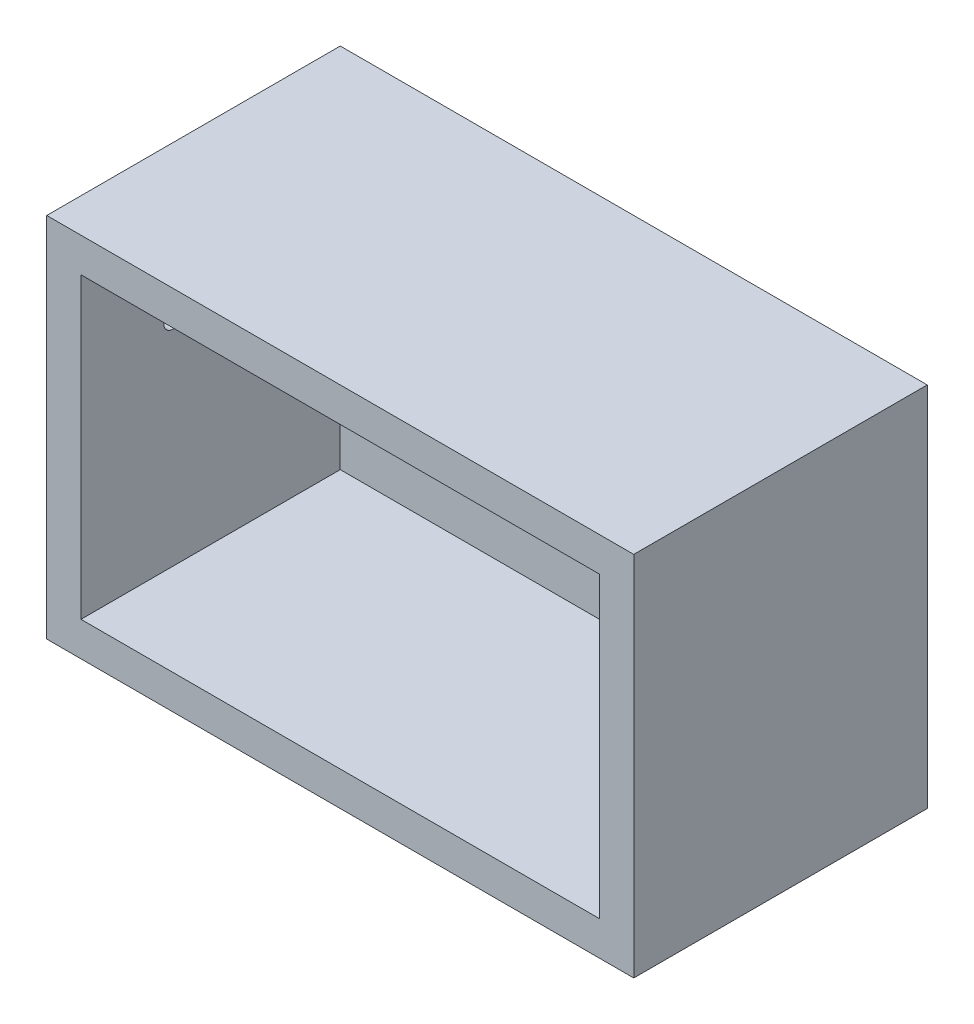
ISO-10303-21;
HEADER;
FILE_DESCRIPTION(('STEP AP214'),'2;1');
FILE_NAME('part.step','',(''),(''),'','','');
FILE_SCHEMA(('AUTOMOTIVE_DESIGN { 1 0 10303 214 1 1 1 1 }'));
ENDSEC;
DATA;
#1=APPLICATION_CONTEXT('core data for automotive mechanical design processes');
#2=APPLICATION_PROTOCOL_DEFINITION('international standard','automotive_design',2000,#1);
#3=PRODUCT_CONTEXT('',#1,'mechanical');
#4=PRODUCT('Part','Part','',(#3));
#5=PRODUCT_RELATED_PRODUCT_CATEGORY('part','',(#4));
#6=PRODUCT_DEFINITION_FORMATION('','',#4);
#7=PRODUCT_DEFINITION_CONTEXT('part definition',#1,'design');
#8=PRODUCT_DEFINITION('design','',#6,#7);
#9=PRODUCT_DEFINITION_SHAPE('','',#8);
#10=(LENGTH_UNIT() NAMED_UNIT(*) SI_UNIT(.MILLI.,.METRE.));
#11=(NAMED_UNIT(*) PLANE_ANGLE_UNIT() SI_UNIT($,.RADIAN.));
#12=(NAMED_UNIT(*) SI_UNIT($,.STERADIAN.) SOLID_ANGLE_UNIT());
#13=UNCERTAINTY_MEASURE_WITH_UNIT(LENGTH_MEASURE(1.E-05),#10,'distance_accuracy_value','');
#14=(GEOMETRIC_REPRESENTATION_CONTEXT(3) GLOBAL_UNCERTAINTY_ASSIGNED_CONTEXT((#13)) GLOBAL_UNIT_ASSIGNED_CONTEXT((#10,
#11,#12)) REPRESENTATION_CONTEXT('',''));
#15=CARTESIAN_POINT('',(0.,0.,0.));
#16=DIRECTION('',(0.,0.,1.));
#17=DIRECTION('',(1.,0.,0.));
#18=AXIS2_PLACEMENT_3D('',#15,#16,#17);
#19=CARTESIAN_POINT('',(0.,0.,7.));
#20=DIRECTION('',(0.,0.,1.));
#21=DIRECTION('',(1.,0.,0.));
#22=AXIS2_PLACEMENT_3D('',#19,#20,#21);
#23=PLANE('',#22);
#24=DIRECTION('',(0.,1.,0.));
#25=VECTOR('',#24,1.);
#26=CARTESIAN_POINT('',(53.,0.,7.));
#27=LINE('',#26,#25);
#28=CARTESIAN_POINT('',(53.,-30.5,7.));
#29=VERTEX_POINT('',#28);
#30=CARTESIAN_POINT('',(53.,30.5,7.));
#31=VERTEX_POINT('',#30);
#32=EDGE_CURVE('E213',#29,#31,#27,.T.);
#33=ORIENTED_EDGE('',*,*,#32,.T.);
#34=DIRECTION('',(-1.,0.,0.));
#35=VECTOR('',#34,1.);
#36=CARTESIAN_POINT('',(0.,30.5,7.));
#37=LINE('',#36,#35);
#38=CARTESIAN_POINT('',(-53.,30.5,7.));
#39=VERTEX_POINT('',#38);
#40=EDGE_CURVE('E191',#31,#39,#37,.T.);
#41=ORIENTED_EDGE('',*,*,#40,.T.);
#42=DIRECTION('',(0.,1.,0.));
#43=VECTOR('',#42,1.);
#44=CARTESIAN_POINT('',(-53.,0.,7.));
#45=LINE('',#44,#43);
#46=CARTESIAN_POINT('',(-53.,-30.5,7.));
#47=VERTEX_POINT('',#46);
#48=EDGE_CURVE('E231',#47,#39,#45,.T.);
#49=ORIENTED_EDGE('',*,*,#48,.F.);
#50=DIRECTION('',(-1.,0.,0.));
#51=VECTOR('',#50,1.);
#52=CARTESIAN_POINT('',(0.,-30.5,7.));
#53=LINE('',#52,#51);
#54=EDGE_CURVE('E203',#29,#47,#53,.T.);
#55=ORIENTED_EDGE('',*,*,#54,.F.);
#56=EDGE_LOOP('',(#33,#41,#49,#55));
#57=FACE_BOUND('',#56,.T.);
#58=ADVANCED_FACE('F42',(#57),#23,.T.);
#59=CARTESIAN_POINT('',(-53.,0.,0.));
#60=DIRECTION('',(1.,0.,0.));
#61=DIRECTION('',(0.,1.,0.));
#62=AXIS2_PLACEMENT_3D('',#59,#60,#61);
#63=PLANE('',#62);
#64=DIRECTION('',(0.,1.,0.));
#65=VECTOR('',#64,1.);
#66=CARTESIAN_POINT('',(-53.,17.5,16.3));
#67=LINE('',#66,#65);
#68=CARTESIAN_POINT('',(-53.,9.00000000000001,16.3));
#69=VERTEX_POINT('',#68);
#70=CARTESIAN_POINT('',(-53.,17.5,16.3));
#71=VERTEX_POINT('',#70);
#72=EDGE_CURVE('E133',#69,#71,#67,.T.);
#73=ORIENTED_EDGE('',*,*,#72,.T.);
#74=DIRECTION('',(0.,0.,-1.));
#75=VECTOR('',#74,1.);
#76=CARTESIAN_POINT('',(-53.,17.5,9.));
#77=LINE('',#76,#75);
#78=CARTESIAN_POINT('',(-53.,17.5,9.));
#79=VERTEX_POINT('',#78);
#80=EDGE_CURVE('E143',#71,#79,#77,.T.);
#81=ORIENTED_EDGE('',*,*,#80,.T.);
#82=DIRECTION('',(0.,-1.,0.));
#83=VECTOR('',#82,1.);
#84=CARTESIAN_POINT('',(-53.,17.5,9.));
#85=LINE('',#84,#83);
#86=CARTESIAN_POINT('',(-53.,9.00000000000001,9.));
#87=VERTEX_POINT('',#86);
#88=EDGE_CURVE('E58',#79,#87,#85,.T.);
#89=ORIENTED_EDGE('',*,*,#88,.T.);
#90=DIRECTION('',(0.,0.,1.));
#91=VECTOR('',#90,1.);
#92=CARTESIAN_POINT('',(-53.,9.00000000000001,9.));
#93=LINE('',#92,#91);
#94=EDGE_CURVE('E140',#87,#69,#93,.T.);
#95=ORIENTED_EDGE('',*,*,#94,.T.);
#96=EDGE_LOOP('',(#73,#81,#89,#95));
#97=FACE_BOUND('',#96,.T.);
#98=CARTESIAN_POINT('',(-53.,13.25,41.3));
#99=DIRECTION('',(-1.,0.,0.));
#100=DIRECTION('',(0.,-1.,0.));
#101=AXIS2_PLACEMENT_3D('',#98,#99,#100);
#102=CIRCLE('',#101,1.75);
#103=CARTESIAN_POINT('',(-53.,11.5,41.3));
#104=VERTEX_POINT('',#103);
#105=EDGE_CURVE('E184',#104,#104,#102,.T.);
#106=ORIENTED_EDGE('',*,*,#105,.T.);
#107=EDGE_LOOP('',(#106));
#108=FACE_BOUND('',#107,.T.);
#109=ORIENTED_EDGE('',*,*,#48,.T.);
#110=DIRECTION('',(0.,0.,1.));
#111=VECTOR('',#110,1.);
#112=CARTESIAN_POINT('',(-53.,30.5,0.));
#113=LINE('',#112,#111);
#114=CARTESIAN_POINT('',(-53.,30.5,60.));
#115=VERTEX_POINT('',#114);
#116=EDGE_CURVE('E195',#39,#115,#113,.T.);
#117=ORIENTED_EDGE('',*,*,#116,.T.);
#118=DIRECTION('',(0.,1.,0.));
#119=VECTOR('',#118,1.);
#120=CARTESIAN_POINT('',(-53.,-37.5,60.));
#121=LINE('',#120,#119);
#122=CARTESIAN_POINT('',(-53.,-30.5,60.));
#123=VERTEX_POINT('',#122);
#124=EDGE_CURVE('E220',#123,#115,#121,.T.);
#125=ORIENTED_EDGE('',*,*,#124,.F.);
#126=DIRECTION('',(0.,0.,1.));
#127=VECTOR('',#126,1.);
#128=CARTESIAN_POINT('',(-53.,-30.5,0.));
#129=LINE('',#128,#127);
#130=EDGE_CURVE('E206',#47,#123,#129,.T.);
#131=ORIENTED_EDGE('',*,*,#130,.F.);
#132=EDGE_LOOP('',(#109,#117,#125,#131));
#133=FACE_BOUND('',#132,.T.);
#134=ADVANCED_FACE('F148',(#97,#108,#133),#63,.T.);
#135=CARTESIAN_POINT('',(53.,0.,0.));
#136=DIRECTION('',(1.,0.,0.));
#137=DIRECTION('',(0.,1.,0.));
#138=AXIS2_PLACEMENT_3D('',#135,#136,#137);
#139=PLANE('',#138);
#140=DIRECTION('',(0.,0.,1.));
#141=VECTOR('',#140,1.);
#142=CARTESIAN_POINT('',(53.,30.5,0.));
#143=LINE('',#142,#141);
#144=CARTESIAN_POINT('',(53.,30.5,60.));
#145=VERTEX_POINT('',#144);
#146=EDGE_CURVE('E11',#31,#145,#143,.T.);
#147=ORIENTED_EDGE('',*,*,#146,.F.);
#148=ORIENTED_EDGE('',*,*,#32,.F.);
#149=DIRECTION('',(0.,0.,1.));
#150=VECTOR('',#149,1.);
#151=CARTESIAN_POINT('',(53.,-30.5,0.));
#152=LINE('',#151,#150);
#153=CARTESIAN_POINT('',(53.,-30.5,60.));
#154=VERTEX_POINT('',#153);
#155=EDGE_CURVE('E51',#29,#154,#152,.T.);
#156=ORIENTED_EDGE('',*,*,#155,.T.);
#157=DIRECTION('',(0.,-1.,0.));
#158=VECTOR('',#157,1.);
#159=CARTESIAN_POINT('',(53.,-37.5,60.));
#160=LINE('',#159,#158);
#161=EDGE_CURVE('E210',#145,#154,#160,.T.);
#162=ORIENTED_EDGE('',*,*,#161,.F.);
#163=EDGE_LOOP('',(#147,#148,#156,#162));
#164=FACE_BOUND('',#163,.T.);
#165=ADVANCED_FACE('F271',(#164),#139,.F.);
#166=CARTESIAN_POINT('',(-60.,37.5,7.));
#167=DIRECTION('',(1.,0.,0.));
#168=DIRECTION('',(0.,1.,0.));
#169=AXIS2_PLACEMENT_3D('',#166,#167,#168);
#170=PLANE('',#169);
#171=DIRECTION('',(0.,0.,-1.));
#172=VECTOR('',#171,1.);
#173=CARTESIAN_POINT('',(-60.,17.5,9.));
#174=LINE('',#173,#172);
#175=CARTESIAN_POINT('',(-60.,17.5,16.3));
#176=VERTEX_POINT('',#175);
#177=CARTESIAN_POINT('',(-60.,17.5,9.));
#178=VERTEX_POINT('',#177);
#179=EDGE_CURVE('E165',#176,#178,#174,.T.);
#180=ORIENTED_EDGE('',*,*,#179,.F.);
#181=DIRECTION('',(0.,1.,0.));
#182=VECTOR('',#181,1.);
#183=CARTESIAN_POINT('',(-60.,17.5,16.3));
#184=LINE('',#183,#182);
#185=CARTESIAN_POINT('',(-60.,9.00000000000001,16.3));
#186=VERTEX_POINT('',#185);
#187=EDGE_CURVE('E66',#186,#176,#184,.T.);
#188=ORIENTED_EDGE('',*,*,#187,.F.);
#189=DIRECTION('',(0.,0.,1.));
#190=VECTOR('',#189,1.);
#191=CARTESIAN_POINT('',(-60.,9.00000000000001,9.));
#192=LINE('',#191,#190);
#193=CARTESIAN_POINT('',(-60.,9.00000000000001,9.));
#194=VERTEX_POINT('',#193);
#195=EDGE_CURVE('E152',#194,#186,#192,.T.);
#196=ORIENTED_EDGE('',*,*,#195,.F.);
#197=DIRECTION('',(0.,-1.,0.));
#198=VECTOR('',#197,1.);
#199=CARTESIAN_POINT('',(-60.,17.5,9.));
#200=LINE('',#199,#198);
#201=EDGE_CURVE('E156',#178,#194,#200,.T.);
#202=ORIENTED_EDGE('',*,*,#201,.F.);
#203=EDGE_LOOP('',(#180,#188,#196,#202));
#204=FACE_BOUND('',#203,.T.);
#205=CARTESIAN_POINT('',(-60.,13.25,41.3));
#206=DIRECTION('',(-1.,0.,0.));
#207=DIRECTION('',(0.,-1.,0.));
#208=AXIS2_PLACEMENT_3D('',#205,#206,#207);
#209=CIRCLE('',#208,1.75);
#210=CARTESIAN_POINT('',(-60.,11.5,41.3));
#211=VERTEX_POINT('',#210);
#212=EDGE_CURVE('E166',#211,#211,#209,.T.);
#213=ORIENTED_EDGE('',*,*,#212,.F.);
#214=EDGE_LOOP('',(#213));
#215=FACE_BOUND('',#214,.T.);
#216=DIRECTION('',(0.,-1.,0.));
#217=VECTOR('',#216,1.);
#218=CARTESIAN_POINT('',(-60.,37.5,0.));
#219=LINE('',#218,#217);
#220=CARTESIAN_POINT('',(-60.,37.5,0.));
#221=VERTEX_POINT('',#220);
#222=CARTESIAN_POINT('',(-60.,-37.5,0.));
#223=VERTEX_POINT('',#222);
#224=EDGE_CURVE('E238',#221,#223,#219,.T.);
#225=ORIENTED_EDGE('',*,*,#224,.T.);
#226=DIRECTION('',(0.,0.,-1.));
#227=VECTOR('',#226,1.);
#228=CARTESIAN_POINT('',(-60.,-37.5,7.));
#229=LINE('',#228,#227);
#230=CARTESIAN_POINT('',(-60.,-37.5,60.));
#231=VERTEX_POINT('',#230);
#232=EDGE_CURVE('E262',#231,#223,#229,.T.);
#233=ORIENTED_EDGE('',*,*,#232,.F.);
#234=DIRECTION('',(0.,1.,0.));
#235=VECTOR('',#234,1.);
#236=CARTESIAN_POINT('',(-60.,-37.5,60.));
#237=LINE('',#236,#235);
#238=CARTESIAN_POINT('',(-60.,37.5,60.));
#239=VERTEX_POINT('',#238);
#240=EDGE_CURVE('E219',#231,#239,#237,.T.);
#241=ORIENTED_EDGE('',*,*,#240,.T.);
#242=DIRECTION('',(0.,0.,-1.));
#243=VECTOR('',#242,1.);
#244=CARTESIAN_POINT('',(-60.,37.5,7.));
#245=LINE('',#244,#243);
#246=EDGE_CURVE('E251',#239,#221,#245,.T.);
#247=ORIENTED_EDGE('',*,*,#246,.T.);
#248=EDGE_LOOP('',(#225,#233,#241,#247));
#249=FACE_BOUND('',#248,.T.);
#250=ADVANCED_FACE('F44',(#204,#215,#249),#170,.F.);
#251=CARTESIAN_POINT('',(-60.,-37.5,7.));
#252=DIRECTION('',(0.,1.,0.));
#253=DIRECTION('',(0.,0.,1.));
#254=AXIS2_PLACEMENT_3D('',#251,#252,#253);
#255=PLANE('',#254);
#256=DIRECTION('',(0.,0.,-1.));
#257=VECTOR('',#256,1.);
#258=CARTESIAN_POINT('',(60.,-37.5,7.));
#259=LINE('',#258,#257);
#260=CARTESIAN_POINT('',(60.,-37.5,60.));
#261=VERTEX_POINT('',#260);
#262=CARTESIAN_POINT('',(60.,-37.5,0.));
#263=VERTEX_POINT('',#262);
#264=EDGE_CURVE('E258',#261,#263,#259,.T.);
#265=ORIENTED_EDGE('',*,*,#264,.F.);
#266=DIRECTION('',(-1.,0.,0.));
#267=VECTOR('',#266,1.);
#268=CARTESIAN_POINT('',(-53.,-37.5,60.));
#269=LINE('',#268,#267);
#270=EDGE_CURVE('E224',#261,#231,#269,.T.);
#271=ORIENTED_EDGE('',*,*,#270,.T.);
#272=ORIENTED_EDGE('',*,*,#232,.T.);
#273=DIRECTION('',(1.,0.,0.));
#274=VECTOR('',#273,1.);
#275=CARTESIAN_POINT('',(-60.,-37.5,0.));
#276=LINE('',#275,#274);
#277=EDGE_CURVE('E241',#223,#263,#276,.T.);
#278=ORIENTED_EDGE('',*,*,#277,.T.);
#279=EDGE_LOOP('',(#265,#271,#272,#278));
#280=FACE_BOUND('',#279,.T.);
#281=ADVANCED_FACE('F314',(#280),#255,.F.);
#282=CARTESIAN_POINT('',(60.,37.5,7.));
#283=DIRECTION('',(1.,0.,0.));
#284=DIRECTION('',(0.,1.,0.));
#285=AXIS2_PLACEMENT_3D('',#282,#283,#284);
#286=PLANE('',#285);
#287=DIRECTION('',(0.,-1.,0.));
#288=VECTOR('',#287,1.);
#289=CARTESIAN_POINT('',(60.,-37.5,60.));
#290=LINE('',#289,#288);
#291=CARTESIAN_POINT('',(60.,37.5,60.));
#292=VERTEX_POINT('',#291);
#293=EDGE_CURVE('E209',#292,#261,#290,.T.);
#294=ORIENTED_EDGE('',*,*,#293,.T.);
#295=ORIENTED_EDGE('',*,*,#264,.T.);
#296=DIRECTION('',(0.,-1.,0.));
#297=VECTOR('',#296,1.);
#298=CARTESIAN_POINT('',(60.,37.5,0.));
#299=LINE('',#298,#297);
#300=CARTESIAN_POINT('',(60.,37.5,0.));
#301=VERTEX_POINT('',#300);
#302=EDGE_CURVE('E245',#301,#263,#299,.T.);
#303=ORIENTED_EDGE('',*,*,#302,.F.);
#304=DIRECTION('',(0.,0.,-1.));
#305=VECTOR('',#304,1.);
#306=CARTESIAN_POINT('',(60.,37.5,7.));
#307=LINE('',#306,#305);
#308=EDGE_CURVE('E254',#292,#301,#307,.T.);
#309=ORIENTED_EDGE('',*,*,#308,.F.);
#310=EDGE_LOOP('',(#294,#295,#303,#309));
#311=FACE_BOUND('',#310,.T.);
#312=ADVANCED_FACE('F311',(#311),#286,.T.);
#313=CARTESIAN_POINT('',(-60.,37.5,7.));
#314=DIRECTION('',(0.,1.,0.));
#315=DIRECTION('',(0.,0.,1.));
#316=AXIS2_PLACEMENT_3D('',#313,#314,#315);
#317=PLANE('',#316);
#318=ORIENTED_EDGE('',*,*,#308,.T.);
#319=DIRECTION('',(1.,0.,0.));
#320=VECTOR('',#319,1.);
#321=CARTESIAN_POINT('',(-60.,37.5,0.));
#322=LINE('',#321,#320);
#323=EDGE_CURVE('E248',#221,#301,#322,.T.);
#324=ORIENTED_EDGE('',*,*,#323,.F.);
#325=ORIENTED_EDGE('',*,*,#246,.F.);
#326=DIRECTION('',(-1.,0.,0.));
#327=VECTOR('',#326,1.);
#328=CARTESIAN_POINT('',(-53.,37.5,60.));
#329=LINE('',#328,#327);
#330=EDGE_CURVE('E227',#292,#239,#329,.T.);
#331=ORIENTED_EDGE('',*,*,#330,.F.);
#332=EDGE_LOOP('',(#318,#324,#325,#331));
#333=FACE_BOUND('',#332,.T.);
#334=ADVANCED_FACE('F307',(#333),#317,.T.);
#335=CARTESIAN_POINT('',(0.,0.,0.));
#336=DIRECTION('',(0.,0.,1.));
#337=DIRECTION('',(1.,0.,0.));
#338=AXIS2_PLACEMENT_3D('',#335,#336,#337);
#339=PLANE('',#338);
#340=ORIENTED_EDGE('',*,*,#302,.T.);
#341=ORIENTED_EDGE('',*,*,#277,.F.);
#342=ORIENTED_EDGE('',*,*,#224,.F.);
#343=ORIENTED_EDGE('',*,*,#323,.T.);
#344=EDGE_LOOP('',(#340,#341,#342,#343));
#345=FACE_BOUND('',#344,.T.);
#346=ADVANCED_FACE('F304',(#345),#339,.F.);
#347=CARTESIAN_POINT('',(-53.,-37.5,60.));
#348=DIRECTION('',(0.,0.,1.));
#349=DIRECTION('',(1.,0.,0.));
#350=AXIS2_PLACEMENT_3D('',#347,#348,#349);
#351=PLANE('',#350);
#352=DIRECTION('',(1.,0.,0.));
#353=VECTOR('',#352,1.);
#354=CARTESIAN_POINT('',(-60.,30.5,60.));
#355=LINE('',#354,#353);
#356=EDGE_CURVE('E175',#115,#145,#355,.T.);
#357=ORIENTED_EDGE('',*,*,#356,.T.);
#358=ORIENTED_EDGE('',*,*,#161,.T.);
#359=DIRECTION('',(-1.,0.,0.));
#360=VECTOR('',#359,1.);
#361=CARTESIAN_POINT('',(-60.,-30.5,60.));
#362=LINE('',#361,#360);
#363=EDGE_CURVE('E199',#154,#123,#362,.T.);
#364=ORIENTED_EDGE('',*,*,#363,.T.);
#365=ORIENTED_EDGE('',*,*,#124,.T.);
#366=EDGE_LOOP('',(#357,#358,#364,#365));
#367=FACE_BOUND('',#366,.T.);
#368=ORIENTED_EDGE('',*,*,#330,.T.);
#369=ORIENTED_EDGE('',*,*,#240,.F.);
#370=ORIENTED_EDGE('',*,*,#270,.F.);
#371=ORIENTED_EDGE('',*,*,#293,.F.);
#372=EDGE_LOOP('',(#368,#369,#370,#371));
#373=FACE_BOUND('',#372,.T.);
#374=ADVANCED_FACE('F282',(#367,#373),#351,.T.);
#375=CARTESIAN_POINT('',(0.,-30.5,0.));
#376=DIRECTION('',(0.,1.,0.));
#377=DIRECTION('',(0.,0.,1.));
#378=AXIS2_PLACEMENT_3D('',#375,#376,#377);
#379=PLANE('',#378);
#380=ORIENTED_EDGE('',*,*,#54,.T.);
#381=ORIENTED_EDGE('',*,*,#130,.T.);
#382=ORIENTED_EDGE('',*,*,#363,.F.);
#383=ORIENTED_EDGE('',*,*,#155,.F.);
#384=EDGE_LOOP('',(#380,#381,#382,#383));
#385=FACE_BOUND('',#384,.T.);
#386=ADVANCED_FACE('F275',(#385),#379,.T.);
#387=CARTESIAN_POINT('',(0.,30.5,0.));
#388=DIRECTION('',(0.,1.,0.));
#389=DIRECTION('',(0.,0.,1.));
#390=AXIS2_PLACEMENT_3D('',#387,#388,#389);
#391=PLANE('',#390);
#392=ORIENTED_EDGE('',*,*,#116,.F.);
#393=ORIENTED_EDGE('',*,*,#40,.F.);
#394=ORIENTED_EDGE('',*,*,#146,.T.);
#395=ORIENTED_EDGE('',*,*,#356,.F.);
#396=EDGE_LOOP('',(#392,#393,#394,#395));
#397=FACE_BOUND('',#396,.T.);
#398=ADVANCED_FACE('F285',(#397),#391,.F.);
#399=CARTESIAN_POINT('',(-53.,13.25,41.3));
#400=DIRECTION('',(-1.,0.,0.));
#401=DIRECTION('',(0.,-1.,0.));
#402=AXIS2_PLACEMENT_3D('',#399,#400,#401);
#403=CYLINDRICAL_SURFACE('',#402,1.75);
#404=ORIENTED_EDGE('',*,*,#105,.F.);
#405=EDGE_LOOP('',(#404));
#406=FACE_BOUND('',#405,.T.);
#407=ORIENTED_EDGE('',*,*,#212,.T.);
#408=EDGE_LOOP('',(#407));
#409=FACE_BOUND('',#408,.T.);
#410=ADVANCED_FACE('F287',(#406,#409),#403,.F.);
#411=CARTESIAN_POINT('',(-53.,17.5,16.3));
#412=DIRECTION('',(0.,0.,1.));
#413=DIRECTION('',(1.,0.,0.));
#414=AXIS2_PLACEMENT_3D('',#411,#412,#413);
#415=PLANE('',#414);
#416=ORIENTED_EDGE('',*,*,#187,.T.);
#417=DIRECTION('',(-1.,0.,0.));
#418=VECTOR('',#417,1.);
#419=CARTESIAN_POINT('',(-53.,17.5,16.3));
#420=LINE('',#419,#418);
#421=EDGE_CURVE('E129',#71,#176,#420,.T.);
#422=ORIENTED_EDGE('',*,*,#421,.F.);
#423=ORIENTED_EDGE('',*,*,#72,.F.);
#424=DIRECTION('',(-1.,0.,0.));
#425=VECTOR('',#424,1.);
#426=CARTESIAN_POINT('',(-53.,9.00000000000001,16.3));
#427=LINE('',#426,#425);
#428=EDGE_CURVE('E172',#69,#186,#427,.T.);
#429=ORIENTED_EDGE('',*,*,#428,.T.);
#430=EDGE_LOOP('',(#416,#422,#423,#429));
#431=FACE_BOUND('',#430,.T.);
#432=ADVANCED_FACE('F131',(#431),#415,.F.);
#433=CARTESIAN_POINT('',(-53.,9.00000000000001,9.));
#434=DIRECTION('',(0.,-1.,0.));
#435=DIRECTION('',(1.,0.,0.));
#436=AXIS2_PLACEMENT_3D('',#433,#434,#435);
#437=PLANE('',#436);
#438=ORIENTED_EDGE('',*,*,#195,.T.);
#439=ORIENTED_EDGE('',*,*,#428,.F.);
#440=ORIENTED_EDGE('',*,*,#94,.F.);
#441=DIRECTION('',(-1.,0.,0.));
#442=VECTOR('',#441,1.);
#443=CARTESIAN_POINT('',(-53.,9.00000000000001,9.));
#444=LINE('',#443,#442);
#445=EDGE_CURVE('E176',#87,#194,#444,.T.);
#446=ORIENTED_EDGE('',*,*,#445,.T.);
#447=EDGE_LOOP('',(#438,#439,#440,#446));
#448=FACE_BOUND('',#447,.T.);
#449=ADVANCED_FACE('F448',(#448),#437,.F.);
#450=CARTESIAN_POINT('',(-53.,17.5,9.));
#451=DIRECTION('',(0.,0.,-1.));
#452=DIRECTION('',(0.,1.,0.));
#453=AXIS2_PLACEMENT_3D('',#450,#451,#452);
#454=PLANE('',#453);
#455=ORIENTED_EDGE('',*,*,#201,.T.);
#456=ORIENTED_EDGE('',*,*,#445,.F.);
#457=ORIENTED_EDGE('',*,*,#88,.F.);
#458=DIRECTION('',(-1.,0.,0.));
#459=VECTOR('',#458,1.);
#460=CARTESIAN_POINT('',(-53.,17.5,9.));
#461=LINE('',#460,#459);
#462=EDGE_CURVE('E139',#79,#178,#461,.T.);
#463=ORIENTED_EDGE('',*,*,#462,.T.);
#464=EDGE_LOOP('',(#455,#456,#457,#463));
#465=FACE_BOUND('',#464,.T.);
#466=ADVANCED_FACE('F458',(#465),#454,.F.);
#467=CARTESIAN_POINT('',(-53.,17.5,9.));
#468=DIRECTION('',(0.,1.,0.));
#469=DIRECTION('',(-1.,0.,0.));
#470=AXIS2_PLACEMENT_3D('',#467,#468,#469);
#471=PLANE('',#470);
#472=ORIENTED_EDGE('',*,*,#179,.T.);
#473=ORIENTED_EDGE('',*,*,#462,.F.);
#474=ORIENTED_EDGE('',*,*,#80,.F.);
#475=ORIENTED_EDGE('',*,*,#421,.T.);
#476=EDGE_LOOP('',(#472,#473,#474,#475));
#477=FACE_BOUND('',#476,.T.);
#478=ADVANCED_FACE('F144',(#477),#471,.F.);
#479=CLOSED_SHELL('',(#58,#134,#165,#250,#281,#312,#334,#346,#374,#386,#398,#410,#432,#449,#466,#478));
#480=MANIFOLD_SOLID_BREP('B2',#479);
#481=ADVANCED_BREP_SHAPE_REPRESENTATION('',(#18,#480),#14);
#482=SHAPE_DEFINITION_REPRESENTATION(#9,#481);
ENDSEC;
END-ISO-10303-21;
